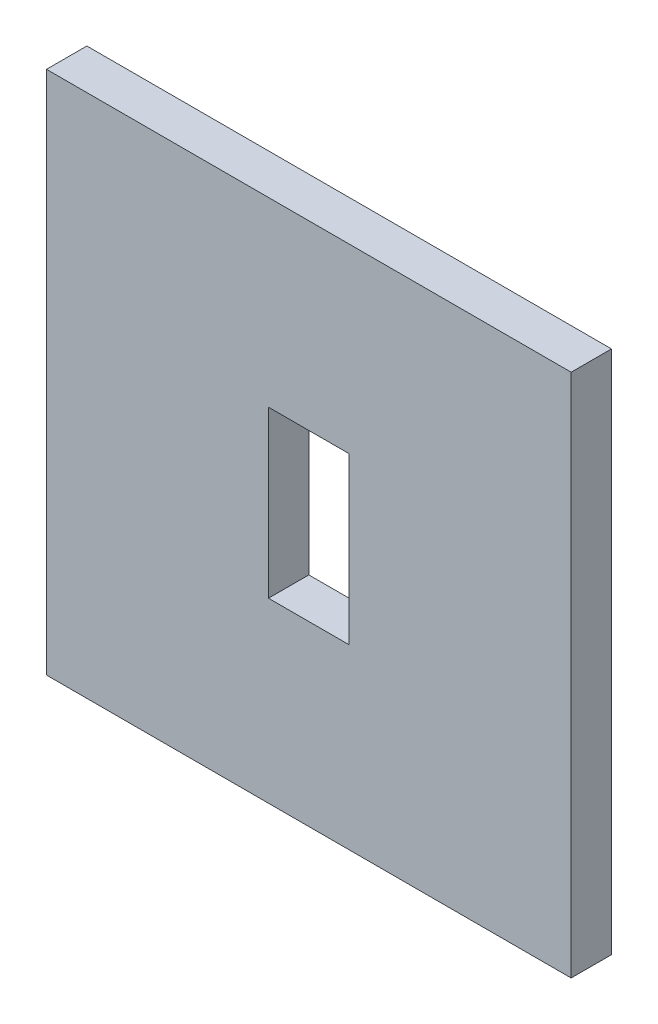
ISO-10303-21;
HEADER;
FILE_DESCRIPTION(('STEP AP214'),'2;1');
FILE_NAME('part.step','',(''),(''),'','','');
FILE_SCHEMA(('AUTOMOTIVE_DESIGN { 1 0 10303 214 1 1 1 1 }'));
ENDSEC;
DATA;
#1=APPLICATION_CONTEXT('core data for automotive mechanical design processes');
#2=APPLICATION_PROTOCOL_DEFINITION('international standard','automotive_design',2000,#1);
#3=PRODUCT_CONTEXT('',#1,'mechanical');
#4=PRODUCT('Part','Part','',(#3));
#5=PRODUCT_RELATED_PRODUCT_CATEGORY('part','',(#4));
#6=PRODUCT_DEFINITION_FORMATION('','',#4);
#7=PRODUCT_DEFINITION_CONTEXT('part definition',#1,'design');
#8=PRODUCT_DEFINITION('design','',#6,#7);
#9=PRODUCT_DEFINITION_SHAPE('','',#8);
#10=(LENGTH_UNIT() NAMED_UNIT(*) SI_UNIT(.MILLI.,.METRE.));
#11=(NAMED_UNIT(*) PLANE_ANGLE_UNIT() SI_UNIT($,.RADIAN.));
#12=(NAMED_UNIT(*) SI_UNIT($,.STERADIAN.) SOLID_ANGLE_UNIT());
#13=UNCERTAINTY_MEASURE_WITH_UNIT(LENGTH_MEASURE(1.E-05),#10,'distance_accuracy_value','');
#14=(GEOMETRIC_REPRESENTATION_CONTEXT(3) GLOBAL_UNCERTAINTY_ASSIGNED_CONTEXT((#13)) GLOBAL_UNIT_ASSIGNED_CONTEXT((#10,
#11,#12)) REPRESENTATION_CONTEXT('',''));
#15=CARTESIAN_POINT('',(0.,0.,0.));
#16=DIRECTION('',(0.,0.,1.));
#17=DIRECTION('',(1.,0.,0.));
#18=AXIS2_PLACEMENT_3D('',#15,#16,#17);
#19=CARTESIAN_POINT('',(0.,0.,10.));
#20=DIRECTION('',(1.,0.,0.));
#21=DIRECTION('',(0.,1.,0.));
#22=AXIS2_PLACEMENT_3D('',#19,#20,#21);
#23=PLANE('',#22);
#24=DIRECTION('',(0.,-1.,0.));
#25=VECTOR('',#24,1.);
#26=CARTESIAN_POINT('',(0.,0.,0.));
#27=LINE('',#26,#25);
#28=CARTESIAN_POINT('',(0.,0.,0.));
#29=VERTEX_POINT('',#28);
#30=CARTESIAN_POINT('',(0.,-130.,0.));
#31=VERTEX_POINT('',#30);
#32=EDGE_CURVE('E130',#29,#31,#27,.T.);
#33=ORIENTED_EDGE('',*,*,#32,.T.);
#34=DIRECTION('',(0.,0.,-1.));
#35=VECTOR('',#34,1.);
#36=CARTESIAN_POINT('',(0.,-130.,10.));
#37=LINE('',#36,#35);
#38=CARTESIAN_POINT('',(0.,-130.,10.));
#39=VERTEX_POINT('',#38);
#40=EDGE_CURVE('E11',#39,#31,#37,.T.);
#41=ORIENTED_EDGE('',*,*,#40,.F.);
#42=DIRECTION('',(0.,-1.,0.));
#43=VECTOR('',#42,1.);
#44=CARTESIAN_POINT('',(0.,0.,10.));
#45=LINE('',#44,#43);
#46=CARTESIAN_POINT('',(0.,0.,10.));
#47=VERTEX_POINT('',#46);
#48=EDGE_CURVE('E134',#47,#39,#45,.T.);
#49=ORIENTED_EDGE('',*,*,#48,.F.);
#50=DIRECTION('',(0.,0.,-1.));
#51=VECTOR('',#50,1.);
#52=CARTESIAN_POINT('',(0.,0.,10.));
#53=LINE('',#52,#51);
#54=EDGE_CURVE('E144',#47,#29,#53,.T.);
#55=ORIENTED_EDGE('',*,*,#54,.T.);
#56=EDGE_LOOP('',(#33,#41,#49,#55));
#57=FACE_BOUND('',#56,.T.);
#58=ADVANCED_FACE('F33',(#57),#23,.F.);
#59=CARTESIAN_POINT('',(0.,-130.,10.));
#60=DIRECTION('',(0.,1.,0.));
#61=DIRECTION('',(0.,0.,1.));
#62=AXIS2_PLACEMENT_3D('',#59,#60,#61);
#63=PLANE('',#62);
#64=DIRECTION('',(1.,0.,0.));
#65=VECTOR('',#64,1.);
#66=CARTESIAN_POINT('',(0.,-130.,0.));
#67=LINE('',#66,#65);
#68=CARTESIAN_POINT('',(130.,-130.,0.));
#69=VERTEX_POINT('',#68);
#70=EDGE_CURVE('E147',#31,#69,#67,.T.);
#71=ORIENTED_EDGE('',*,*,#70,.T.);
#72=DIRECTION('',(0.,0.,-1.));
#73=VECTOR('',#72,1.);
#74=CARTESIAN_POINT('',(130.,-130.,10.));
#75=LINE('',#74,#73);
#76=CARTESIAN_POINT('',(130.,-130.,10.));
#77=VERTEX_POINT('',#76);
#78=EDGE_CURVE('E40',#77,#69,#75,.T.);
#79=ORIENTED_EDGE('',*,*,#78,.F.);
#80=DIRECTION('',(1.,0.,0.));
#81=VECTOR('',#80,1.);
#82=CARTESIAN_POINT('',(0.,-130.,10.));
#83=LINE('',#82,#81);
#84=EDGE_CURVE('E137',#39,#77,#83,.T.);
#85=ORIENTED_EDGE('',*,*,#84,.F.);
#86=ORIENTED_EDGE('',*,*,#40,.T.);
#87=EDGE_LOOP('',(#71,#79,#85,#86));
#88=FACE_BOUND('',#87,.T.);
#89=ADVANCED_FACE('F175',(#88),#63,.F.);
#90=CARTESIAN_POINT('',(130.,0.,10.));
#91=DIRECTION('',(-1.,0.,0.));
#92=DIRECTION('',(0.,-1.,0.));
#93=AXIS2_PLACEMENT_3D('',#90,#91,#92);
#94=PLANE('',#93);
#95=DIRECTION('',(0.,1.,0.));
#96=VECTOR('',#95,1.);
#97=CARTESIAN_POINT('',(130.,0.,0.));
#98=LINE('',#97,#96);
#99=CARTESIAN_POINT('',(130.,0.,0.));
#100=VERTEX_POINT('',#99);
#101=EDGE_CURVE('E149',#69,#100,#98,.T.);
#102=ORIENTED_EDGE('',*,*,#101,.T.);
#103=DIRECTION('',(0.,0.,-1.));
#104=VECTOR('',#103,1.);
#105=CARTESIAN_POINT('',(130.,0.,10.));
#106=LINE('',#105,#104);
#107=CARTESIAN_POINT('',(130.,0.,10.));
#108=VERTEX_POINT('',#107);
#109=EDGE_CURVE('E154',#108,#100,#106,.T.);
#110=ORIENTED_EDGE('',*,*,#109,.F.);
#111=DIRECTION('',(0.,1.,0.));
#112=VECTOR('',#111,1.);
#113=CARTESIAN_POINT('',(130.,0.,10.));
#114=LINE('',#113,#112);
#115=EDGE_CURVE('E140',#77,#108,#114,.T.);
#116=ORIENTED_EDGE('',*,*,#115,.F.);
#117=ORIENTED_EDGE('',*,*,#78,.T.);
#118=EDGE_LOOP('',(#102,#110,#116,#117));
#119=FACE_BOUND('',#118,.T.);
#120=ADVANCED_FACE('F161',(#119),#94,.F.);
#121=CARTESIAN_POINT('',(0.,0.,10.));
#122=DIRECTION('',(0.,-1.,0.));
#123=DIRECTION('',(0.,0.,-1.));
#124=AXIS2_PLACEMENT_3D('',#121,#122,#123);
#125=PLANE('',#124);
#126=DIRECTION('',(-1.,0.,0.));
#127=VECTOR('',#126,1.);
#128=CARTESIAN_POINT('',(0.,0.,0.));
#129=LINE('',#128,#127);
#130=EDGE_CURVE('E138',#100,#29,#129,.T.);
#131=ORIENTED_EDGE('',*,*,#130,.T.);
#132=ORIENTED_EDGE('',*,*,#54,.F.);
#133=DIRECTION('',(-1.,0.,0.));
#134=VECTOR('',#133,1.);
#135=CARTESIAN_POINT('',(0.,0.,10.));
#136=LINE('',#135,#134);
#137=EDGE_CURVE('E142',#108,#47,#136,.T.);
#138=ORIENTED_EDGE('',*,*,#137,.F.);
#139=ORIENTED_EDGE('',*,*,#109,.T.);
#140=EDGE_LOOP('',(#131,#132,#138,#139));
#141=FACE_BOUND('',#140,.T.);
#142=ADVANCED_FACE('F168',(#141),#125,.F.);
#143=CARTESIAN_POINT('',(0.,0.,10.));
#144=DIRECTION('',(0.,0.,1.));
#145=DIRECTION('',(1.,0.,0.));
#146=AXIS2_PLACEMENT_3D('',#143,#144,#145);
#147=PLANE('',#146);
#148=DIRECTION('',(0.,-1.,0.));
#149=VECTOR('',#148,1.);
#150=CARTESIAN_POINT('',(55.,-45.,10.));
#151=LINE('',#150,#149);
#152=CARTESIAN_POINT('',(55.,-45.,10.));
#153=VERTEX_POINT('',#152);
#154=CARTESIAN_POINT('',(55.,-86.,10.));
#155=VERTEX_POINT('',#154);
#156=EDGE_CURVE('E47',#153,#155,#151,.T.);
#157=ORIENTED_EDGE('',*,*,#156,.F.);
#158=DIRECTION('',(-1.,0.,0.));
#159=VECTOR('',#158,1.);
#160=CARTESIAN_POINT('',(55.,-45.,10.));
#161=LINE('',#160,#159);
#162=CARTESIAN_POINT('',(75.,-45.,10.));
#163=VERTEX_POINT('',#162);
#164=EDGE_CURVE('E115',#163,#153,#161,.T.);
#165=ORIENTED_EDGE('',*,*,#164,.F.);
#166=DIRECTION('',(0.,1.,0.));
#167=VECTOR('',#166,1.);
#168=CARTESIAN_POINT('',(75.,-45.,10.));
#169=LINE('',#168,#167);
#170=CARTESIAN_POINT('',(75.,-86.,10.));
#171=VERTEX_POINT('',#170);
#172=EDGE_CURVE('E118',#171,#163,#169,.T.);
#173=ORIENTED_EDGE('',*,*,#172,.F.);
#174=DIRECTION('',(1.,0.,0.));
#175=VECTOR('',#174,1.);
#176=CARTESIAN_POINT('',(55.,-86.,10.));
#177=LINE('',#176,#175);
#178=EDGE_CURVE('E124',#155,#171,#177,.T.);
#179=ORIENTED_EDGE('',*,*,#178,.F.);
#180=EDGE_LOOP('',(#157,#165,#173,#179));
#181=FACE_BOUND('',#180,.T.);
#182=ORIENTED_EDGE('',*,*,#48,.T.);
#183=ORIENTED_EDGE('',*,*,#84,.T.);
#184=ORIENTED_EDGE('',*,*,#115,.T.);
#185=ORIENTED_EDGE('',*,*,#137,.T.);
#186=EDGE_LOOP('',(#182,#183,#184,#185));
#187=FACE_BOUND('',#186,.T.);
#188=ADVANCED_FACE('F174',(#181,#187),#147,.T.);
#189=CARTESIAN_POINT('',(0.,0.,0.));
#190=DIRECTION('',(0.,0.,1.));
#191=DIRECTION('',(1.,0.,0.));
#192=AXIS2_PLACEMENT_3D('',#189,#190,#191);
#193=PLANE('',#192);
#194=DIRECTION('',(-1.,0.,0.));
#195=VECTOR('',#194,1.);
#196=CARTESIAN_POINT('',(55.,-45.,0.));
#197=LINE('',#196,#195);
#198=CARTESIAN_POINT('',(75.,-45.,0.));
#199=VERTEX_POINT('',#198);
#200=CARTESIAN_POINT('',(55.,-45.,0.));
#201=VERTEX_POINT('',#200);
#202=EDGE_CURVE('E105',#199,#201,#197,.T.);
#203=ORIENTED_EDGE('',*,*,#202,.T.);
#204=DIRECTION('',(0.,-1.,0.));
#205=VECTOR('',#204,1.);
#206=CARTESIAN_POINT('',(55.,-45.,0.));
#207=LINE('',#206,#205);
#208=CARTESIAN_POINT('',(55.,-86.,0.));
#209=VERTEX_POINT('',#208);
#210=EDGE_CURVE('E99',#201,#209,#207,.T.);
#211=ORIENTED_EDGE('',*,*,#210,.T.);
#212=DIRECTION('',(1.,0.,0.));
#213=VECTOR('',#212,1.);
#214=CARTESIAN_POINT('',(55.,-86.,0.));
#215=LINE('',#214,#213);
#216=CARTESIAN_POINT('',(75.,-86.,0.));
#217=VERTEX_POINT('',#216);
#218=EDGE_CURVE('E108',#209,#217,#215,.T.);
#219=ORIENTED_EDGE('',*,*,#218,.T.);
#220=DIRECTION('',(0.,1.,0.));
#221=VECTOR('',#220,1.);
#222=CARTESIAN_POINT('',(75.,-45.,0.));
#223=LINE('',#222,#221);
#224=EDGE_CURVE('E55',#217,#199,#223,.T.);
#225=ORIENTED_EDGE('',*,*,#224,.T.);
#226=EDGE_LOOP('',(#203,#211,#219,#225));
#227=FACE_BOUND('',#226,.T.);
#228=ORIENTED_EDGE('',*,*,#32,.F.);
#229=ORIENTED_EDGE('',*,*,#130,.F.);
#230=ORIENTED_EDGE('',*,*,#101,.F.);
#231=ORIENTED_EDGE('',*,*,#70,.F.);
#232=EDGE_LOOP('',(#228,#229,#230,#231));
#233=FACE_BOUND('',#232,.T.);
#234=ADVANCED_FACE('F112',(#227,#233),#193,.F.);
#235=CARTESIAN_POINT('',(55.,-45.,0.));
#236=DIRECTION('',(-1.,0.,0.));
#237=DIRECTION('',(0.,-1.,0.));
#238=AXIS2_PLACEMENT_3D('',#235,#236,#237);
#239=PLANE('',#238);
#240=ORIENTED_EDGE('',*,*,#156,.T.);
#241=DIRECTION('',(0.,0.,1.));
#242=VECTOR('',#241,1.);
#243=CARTESIAN_POINT('',(55.,-86.,0.));
#244=LINE('',#243,#242);
#245=EDGE_CURVE('E95',#209,#155,#244,.T.);
#246=ORIENTED_EDGE('',*,*,#245,.F.);
#247=ORIENTED_EDGE('',*,*,#210,.F.);
#248=DIRECTION('',(0.,0.,1.));
#249=VECTOR('',#248,1.);
#250=CARTESIAN_POINT('',(55.,-45.,0.));
#251=LINE('',#250,#249);
#252=EDGE_CURVE('E128',#201,#153,#251,.T.);
#253=ORIENTED_EDGE('',*,*,#252,.T.);
#254=EDGE_LOOP('',(#240,#246,#247,#253));
#255=FACE_BOUND('',#254,.T.);
#256=ADVANCED_FACE('F97',(#255),#239,.F.);
#257=CARTESIAN_POINT('',(55.,-45.,0.));
#258=DIRECTION('',(0.,1.,0.));
#259=DIRECTION('',(-1.,0.,0.));
#260=AXIS2_PLACEMENT_3D('',#257,#258,#259);
#261=PLANE('',#260);
#262=ORIENTED_EDGE('',*,*,#164,.T.);
#263=ORIENTED_EDGE('',*,*,#252,.F.);
#264=ORIENTED_EDGE('',*,*,#202,.F.);
#265=DIRECTION('',(0.,0.,1.));
#266=VECTOR('',#265,1.);
#267=CARTESIAN_POINT('',(75.,-45.,0.));
#268=LINE('',#267,#266);
#269=EDGE_CURVE('E131',#199,#163,#268,.T.);
#270=ORIENTED_EDGE('',*,*,#269,.T.);
#271=EDGE_LOOP('',(#262,#263,#264,#270));
#272=FACE_BOUND('',#271,.T.);
#273=ADVANCED_FACE('F192',(#272),#261,.F.);
#274=CARTESIAN_POINT('',(75.,-45.,0.));
#275=DIRECTION('',(1.,0.,0.));
#276=DIRECTION('',(0.,0.,-1.));
#277=AXIS2_PLACEMENT_3D('',#274,#275,#276);
#278=PLANE('',#277);
#279=ORIENTED_EDGE('',*,*,#172,.T.);
#280=ORIENTED_EDGE('',*,*,#269,.F.);
#281=ORIENTED_EDGE('',*,*,#224,.F.);
#282=DIRECTION('',(0.,0.,1.));
#283=VECTOR('',#282,1.);
#284=CARTESIAN_POINT('',(75.,-86.,0.));
#285=LINE('',#284,#283);
#286=EDGE_CURVE('E104',#217,#171,#285,.T.);
#287=ORIENTED_EDGE('',*,*,#286,.T.);
#288=EDGE_LOOP('',(#279,#280,#281,#287));
#289=FACE_BOUND('',#288,.T.);
#290=ADVANCED_FACE('F195',(#289),#278,.F.);
#291=CARTESIAN_POINT('',(55.,-86.,0.));
#292=DIRECTION('',(0.,-1.,0.));
#293=DIRECTION('',(0.,0.,-1.));
#294=AXIS2_PLACEMENT_3D('',#291,#292,#293);
#295=PLANE('',#294);
#296=ORIENTED_EDGE('',*,*,#178,.T.);
#297=ORIENTED_EDGE('',*,*,#286,.F.);
#298=ORIENTED_EDGE('',*,*,#218,.F.);
#299=ORIENTED_EDGE('',*,*,#245,.T.);
#300=EDGE_LOOP('',(#296,#297,#298,#299));
#301=FACE_BOUND('',#300,.T.);
#302=ADVANCED_FACE('F109',(#301),#295,.F.);
#303=CLOSED_SHELL('',(#58,#89,#120,#142,#188,#234,#256,#273,#290,#302));
#304=MANIFOLD_SOLID_BREP('B2',#303);
#305=ADVANCED_BREP_SHAPE_REPRESENTATION('',(#18,#304),#14);
#306=SHAPE_DEFINITION_REPRESENTATION(#9,#305);
ENDSEC;
END-ISO-10303-21;
